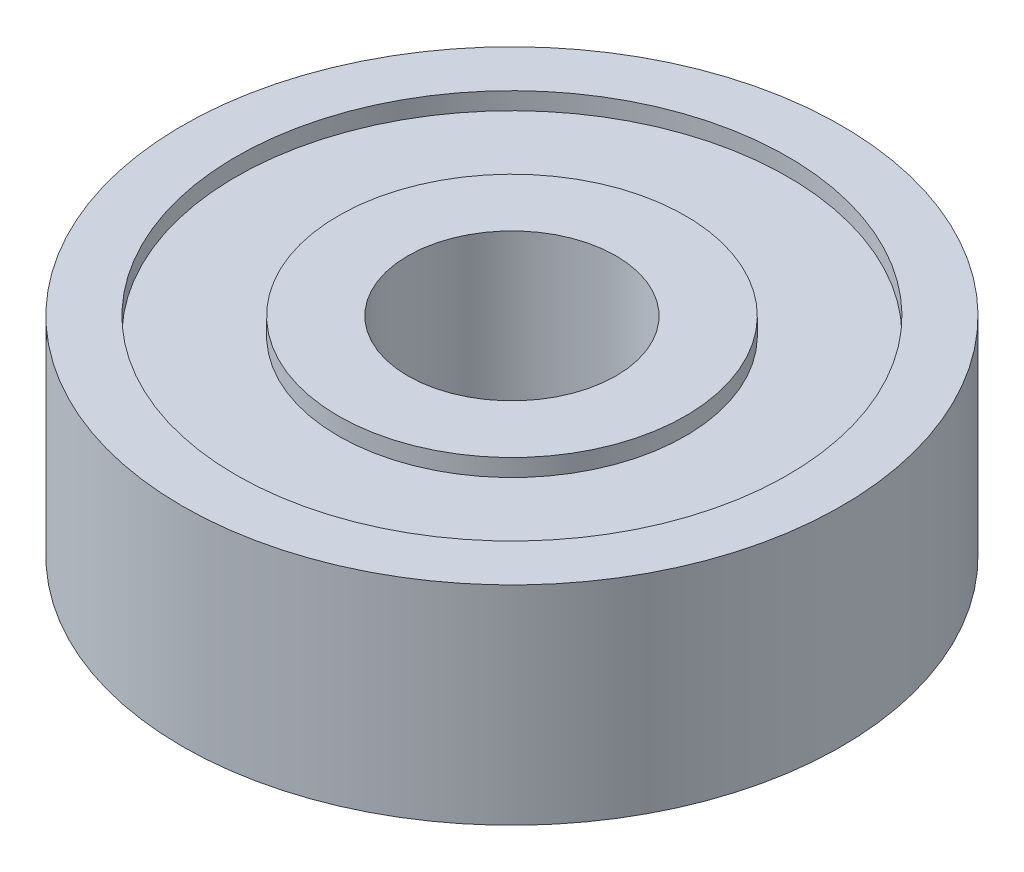
ISO-10303-21;
HEADER;
FILE_DESCRIPTION(('STEP AP214'),'2;1');
FILE_NAME('part.step','',(''),(''),'','','');
FILE_SCHEMA(('AUTOMOTIVE_DESIGN { 1 0 10303 214 1 1 1 1 }'));
ENDSEC;
DATA;
#1=APPLICATION_CONTEXT('core data for automotive mechanical design processes');
#2=APPLICATION_PROTOCOL_DEFINITION('international standard','automotive_design',2000,#1);
#3=PRODUCT_CONTEXT('',#1,'mechanical');
#4=PRODUCT('Part','Part','',(#3));
#5=PRODUCT_RELATED_PRODUCT_CATEGORY('part','',(#4));
#6=PRODUCT_DEFINITION_FORMATION('','',#4);
#7=PRODUCT_DEFINITION_CONTEXT('part definition',#1,'design');
#8=PRODUCT_DEFINITION('design','',#6,#7);
#9=PRODUCT_DEFINITION_SHAPE('','',#8);
#10=(LENGTH_UNIT() NAMED_UNIT(*) SI_UNIT(.MILLI.,.METRE.));
#11=(NAMED_UNIT(*) PLANE_ANGLE_UNIT() SI_UNIT($,.RADIAN.));
#12=(NAMED_UNIT(*) SI_UNIT($,.STERADIAN.) SOLID_ANGLE_UNIT());
#13=UNCERTAINTY_MEASURE_WITH_UNIT(LENGTH_MEASURE(1.E-05),#10,'distance_accuracy_value','');
#14=(GEOMETRIC_REPRESENTATION_CONTEXT(3) GLOBAL_UNCERTAINTY_ASSIGNED_CONTEXT((#13)) GLOBAL_UNIT_ASSIGNED_CONTEXT((#10,
#11,#12)) REPRESENTATION_CONTEXT('',''));
#15=CARTESIAN_POINT('',(0.,0.,0.));
#16=DIRECTION('',(0.,0.,1.));
#17=DIRECTION('',(1.,0.,0.));
#18=AXIS2_PLACEMENT_3D('',#15,#16,#17);
#19=CARTESIAN_POINT('',(0.,0.,0.));
#20=DIRECTION('',(0.,1.,0.));
#21=DIRECTION('',(0.,0.,1.));
#22=AXIS2_PLACEMENT_3D('',#19,#20,#21);
#23=PLANE('',#22);
#24=CARTESIAN_POINT('',(0.,0.,0.));
#25=DIRECTION('',(0.,1.,0.));
#26=DIRECTION('',(0.,0.,1.));
#27=AXIS2_PLACEMENT_3D('',#24,#25,#26);
#28=CIRCLE('',#27,3.);
#29=CARTESIAN_POINT('',(0.,0.,3.));
#30=VERTEX_POINT('',#29);
#31=EDGE_CURVE('E46',#30,#30,#28,.T.);
#32=ORIENTED_EDGE('',*,*,#31,.T.);
#33=EDGE_LOOP('',(#32));
#34=FACE_BOUND('',#33,.T.);
#35=CARTESIAN_POINT('',(0.,0.,0.));
#36=DIRECTION('',(0.,-1.,0.));
#37=DIRECTION('',(0.,0.,-1.));
#38=AXIS2_PLACEMENT_3D('',#35,#36,#37);
#39=CIRCLE('',#38,5.00247672148134);
#40=CARTESIAN_POINT('',(0.,0.,-5.00247672148134));
#41=VERTEX_POINT('',#40);
#42=EDGE_CURVE('E70',#41,#41,#39,.T.);
#43=ORIENTED_EDGE('',*,*,#42,.T.);
#44=EDGE_LOOP('',(#43));
#45=FACE_BOUND('',#44,.T.);
#46=ADVANCED_FACE('F33',(#34,#45),#23,.F.);
#47=CARTESIAN_POINT('',(0.,6.,0.));
#48=DIRECTION('',(0.,1.,0.));
#49=DIRECTION('',(0.,0.,1.));
#50=AXIS2_PLACEMENT_3D('',#47,#48,#49);
#51=PLANE('',#50);
#52=CARTESIAN_POINT('',(0.,6.,0.));
#53=DIRECTION('',(0.,1.,0.));
#54=DIRECTION('',(0.,0.,1.));
#55=AXIS2_PLACEMENT_3D('',#52,#53,#54);
#56=CIRCLE('',#55,3.);
#57=CARTESIAN_POINT('',(0.,6.,3.));
#58=VERTEX_POINT('',#57);
#59=EDGE_CURVE('E44',#58,#58,#56,.T.);
#60=ORIENTED_EDGE('',*,*,#59,.F.);
#61=EDGE_LOOP('',(#60));
#62=FACE_BOUND('',#61,.T.);
#63=CARTESIAN_POINT('',(0.,6.,0.));
#64=DIRECTION('',(0.,1.,0.));
#65=DIRECTION('',(0.,0.,1.));
#66=AXIS2_PLACEMENT_3D('',#63,#64,#65);
#67=CIRCLE('',#66,5.00145345061101);
#68=CARTESIAN_POINT('',(0.,6.,5.00145345061101));
#69=VERTEX_POINT('',#68);
#70=EDGE_CURVE('E58',#69,#69,#67,.T.);
#71=ORIENTED_EDGE('',*,*,#70,.T.);
#72=EDGE_LOOP('',(#71));
#73=FACE_BOUND('',#72,.T.);
#74=ADVANCED_FACE('F108',(#62,#73),#51,.T.);
#75=CARTESIAN_POINT('',(0.,6.,0.));
#76=DIRECTION('',(0.,1.,0.));
#77=DIRECTION('',(0.,0.,1.));
#78=AXIS2_PLACEMENT_3D('',#75,#76,#77);
#79=CIRCLE('',#78,7.95);
#80=CARTESIAN_POINT('',(0.,6.,7.95));
#81=VERTEX_POINT('',#80);
#82=EDGE_CURVE('E52',#81,#81,#79,.T.);
#83=ORIENTED_EDGE('',*,*,#82,.F.);
#84=EDGE_LOOP('',(#83));
#85=FACE_BOUND('',#84,.T.);
#86=CARTESIAN_POINT('',(0.,6.,0.));
#87=DIRECTION('',(0.,1.,0.));
#88=DIRECTION('',(0.,0.,1.));
#89=AXIS2_PLACEMENT_3D('',#86,#87,#88);
#90=CIRCLE('',#89,9.5);
#91=CARTESIAN_POINT('',(0.,6.,9.5));
#92=VERTEX_POINT('',#91);
#93=EDGE_CURVE('E10',#92,#92,#90,.T.);
#94=ORIENTED_EDGE('',*,*,#93,.T.);
#95=EDGE_LOOP('',(#94));
#96=FACE_BOUND('',#95,.T.);
#97=ADVANCED_FACE('F95',(#85,#96),#51,.T.);
#98=CARTESIAN_POINT('',(0.,0.,0.));
#99=DIRECTION('',(0.,-1.,0.));
#100=DIRECTION('',(0.,0.,-1.));
#101=AXIS2_PLACEMENT_3D('',#98,#99,#100);
#102=CIRCLE('',#101,7.95);
#103=CARTESIAN_POINT('',(0.,0.,-7.95));
#104=VERTEX_POINT('',#103);
#105=EDGE_CURVE('E64',#104,#104,#102,.T.);
#106=ORIENTED_EDGE('',*,*,#105,.F.);
#107=EDGE_LOOP('',(#106));
#108=FACE_BOUND('',#107,.T.);
#109=CARTESIAN_POINT('',(0.,0.,0.));
#110=DIRECTION('',(0.,1.,0.));
#111=DIRECTION('',(0.,0.,1.));
#112=AXIS2_PLACEMENT_3D('',#109,#110,#111);
#113=CIRCLE('',#112,9.5);
#114=CARTESIAN_POINT('',(0.,0.,9.5));
#115=VERTEX_POINT('',#114);
#116=EDGE_CURVE('E37',#115,#115,#113,.T.);
#117=ORIENTED_EDGE('',*,*,#116,.F.);
#118=EDGE_LOOP('',(#117));
#119=FACE_BOUND('',#118,.T.);
#120=ADVANCED_FACE('F92',(#108,#119),#23,.F.);
#121=CARTESIAN_POINT('',(0.,6.,0.));
#122=DIRECTION('',(0.,-1.,0.));
#123=DIRECTION('',(0.,0.,-1.));
#124=AXIS2_PLACEMENT_3D('',#121,#122,#123);
#125=CYLINDRICAL_SURFACE('',#124,9.5);
#126=ORIENTED_EDGE('',*,*,#93,.F.);
#127=EDGE_LOOP('',(#126));
#128=FACE_BOUND('',#127,.T.);
#129=ORIENTED_EDGE('',*,*,#116,.T.);
#130=EDGE_LOOP('',(#129));
#131=FACE_BOUND('',#130,.T.);
#132=ADVANCED_FACE('F35',(#128,#131),#125,.T.);
#133=CARTESIAN_POINT('',(0.,6.,0.));
#134=DIRECTION('',(0.,-1.,0.));
#135=DIRECTION('',(0.,0.,-1.));
#136=AXIS2_PLACEMENT_3D('',#133,#134,#135);
#137=CYLINDRICAL_SURFACE('',#136,3.);
#138=ORIENTED_EDGE('',*,*,#59,.T.);
#139=EDGE_LOOP('',(#138));
#140=FACE_BOUND('',#139,.T.);
#141=ORIENTED_EDGE('',*,*,#31,.F.);
#142=EDGE_LOOP('',(#141));
#143=FACE_BOUND('',#142,.T.);
#144=ADVANCED_FACE('F99',(#140,#143),#137,.F.);
#145=CARTESIAN_POINT('',(0.,5.5,0.));
#146=DIRECTION('',(0.,1.,0.));
#147=DIRECTION('',(0.,0.,1.));
#148=AXIS2_PLACEMENT_3D('',#145,#146,#147);
#149=CYLINDRICAL_SURFACE('',#148,7.95);
#150=CARTESIAN_POINT('',(0.,5.5,0.));
#151=DIRECTION('',(0.,1.,0.));
#152=DIRECTION('',(0.,0.,1.));
#153=AXIS2_PLACEMENT_3D('',#150,#151,#152);
#154=CIRCLE('',#153,7.95);
#155=CARTESIAN_POINT('',(0.,5.5,7.95));
#156=VERTEX_POINT('',#155);
#157=EDGE_CURVE('E49',#156,#156,#154,.T.);
#158=ORIENTED_EDGE('',*,*,#157,.F.);
#159=EDGE_LOOP('',(#158));
#160=FACE_BOUND('',#159,.T.);
#161=ORIENTED_EDGE('',*,*,#82,.T.);
#162=EDGE_LOOP('',(#161));
#163=FACE_BOUND('',#162,.T.);
#164=ADVANCED_FACE('F104',(#160,#163),#149,.F.);
#165=CARTESIAN_POINT('',(0.,5.5,0.));
#166=DIRECTION('',(0.,1.,0.));
#167=DIRECTION('',(0.,0.,1.));
#168=AXIS2_PLACEMENT_3D('',#165,#166,#167);
#169=PLANE('',#168);
#170=CARTESIAN_POINT('',(0.,5.5,0.));
#171=DIRECTION('',(0.,1.,0.));
#172=DIRECTION('',(0.,0.,1.));
#173=AXIS2_PLACEMENT_3D('',#170,#171,#172);
#174=CIRCLE('',#173,5.00145345061101);
#175=CARTESIAN_POINT('',(0.,5.5,5.00145345061101));
#176=VERTEX_POINT('',#175);
#177=EDGE_CURVE('E55',#176,#176,#174,.T.);
#178=ORIENTED_EDGE('',*,*,#177,.F.);
#179=EDGE_LOOP('',(#178));
#180=FACE_BOUND('',#179,.T.);
#181=ORIENTED_EDGE('',*,*,#157,.T.);
#182=EDGE_LOOP('',(#181));
#183=FACE_BOUND('',#182,.T.);
#184=ADVANCED_FACE('F121',(#180,#183),#169,.T.);
#185=CARTESIAN_POINT('',(0.,5.5,0.));
#186=DIRECTION('',(0.,1.,0.));
#187=DIRECTION('',(0.,0.,1.));
#188=AXIS2_PLACEMENT_3D('',#185,#186,#187);
#189=CYLINDRICAL_SURFACE('',#188,5.00145345061101);
#190=ORIENTED_EDGE('',*,*,#177,.T.);
#191=EDGE_LOOP('',(#190));
#192=FACE_BOUND('',#191,.T.);
#193=ORIENTED_EDGE('',*,*,#70,.F.);
#194=EDGE_LOOP('',(#193));
#195=FACE_BOUND('',#194,.T.);
#196=ADVANCED_FACE('F88',(#192,#195),#189,.T.);
#197=CARTESIAN_POINT('',(0.,0.5,0.));
#198=DIRECTION('',(0.,-1.,0.));
#199=DIRECTION('',(0.,0.,-1.));
#200=AXIS2_PLACEMENT_3D('',#197,#198,#199);
#201=CYLINDRICAL_SURFACE('',#200,7.95);
#202=CARTESIAN_POINT('',(0.,0.5,0.));
#203=DIRECTION('',(0.,-1.,0.));
#204=DIRECTION('',(0.,0.,-1.));
#205=AXIS2_PLACEMENT_3D('',#202,#203,#204);
#206=CIRCLE('',#205,7.95);
#207=CARTESIAN_POINT('',(0.,0.5,-7.95));
#208=VERTEX_POINT('',#207);
#209=EDGE_CURVE('E61',#208,#208,#206,.T.);
#210=ORIENTED_EDGE('',*,*,#209,.F.);
#211=EDGE_LOOP('',(#210));
#212=FACE_BOUND('',#211,.T.);
#213=ORIENTED_EDGE('',*,*,#105,.T.);
#214=EDGE_LOOP('',(#213));
#215=FACE_BOUND('',#214,.T.);
#216=ADVANCED_FACE('F82',(#212,#215),#201,.F.);
#217=CARTESIAN_POINT('',(0.,0.5,0.));
#218=DIRECTION('',(0.,-1.,0.));
#219=DIRECTION('',(0.,0.,-1.));
#220=AXIS2_PLACEMENT_3D('',#217,#218,#219);
#221=PLANE('',#220);
#222=CARTESIAN_POINT('',(0.,0.5,0.));
#223=DIRECTION('',(0.,-1.,0.));
#224=DIRECTION('',(0.,0.,-1.));
#225=AXIS2_PLACEMENT_3D('',#222,#223,#224);
#226=CIRCLE('',#225,5.00247672148134);
#227=CARTESIAN_POINT('',(0.,0.5,-5.00247672148134));
#228=VERTEX_POINT('',#227);
#229=EDGE_CURVE('E67',#228,#228,#226,.T.);
#230=ORIENTED_EDGE('',*,*,#229,.F.);
#231=EDGE_LOOP('',(#230));
#232=FACE_BOUND('',#231,.T.);
#233=ORIENTED_EDGE('',*,*,#209,.T.);
#234=EDGE_LOOP('',(#233));
#235=FACE_BOUND('',#234,.T.);
#236=ADVANCED_FACE('F79',(#232,#235),#221,.T.);
#237=CARTESIAN_POINT('',(0.,0.5,0.));
#238=DIRECTION('',(0.,-1.,0.));
#239=DIRECTION('',(0.,0.,-1.));
#240=AXIS2_PLACEMENT_3D('',#237,#238,#239);
#241=CYLINDRICAL_SURFACE('',#240,5.00247672148134);
#242=ORIENTED_EDGE('',*,*,#229,.T.);
#243=EDGE_LOOP('',(#242));
#244=FACE_BOUND('',#243,.T.);
#245=ORIENTED_EDGE('',*,*,#42,.F.);
#246=EDGE_LOOP('',(#245));
#247=FACE_BOUND('',#246,.T.);
#248=ADVANCED_FACE('F76',(#244,#247),#241,.T.);
#249=CLOSED_SHELL('',(#46,#74,#97,#120,#132,#144,#164,#184,#196,#216,#236,#248));
#250=MANIFOLD_SOLID_BREP('B2',#249);
#251=ADVANCED_BREP_SHAPE_REPRESENTATION('',(#18,#250),#14);
#252=SHAPE_DEFINITION_REPRESENTATION(#9,#251);
ENDSEC;
END-ISO-10303-21;
